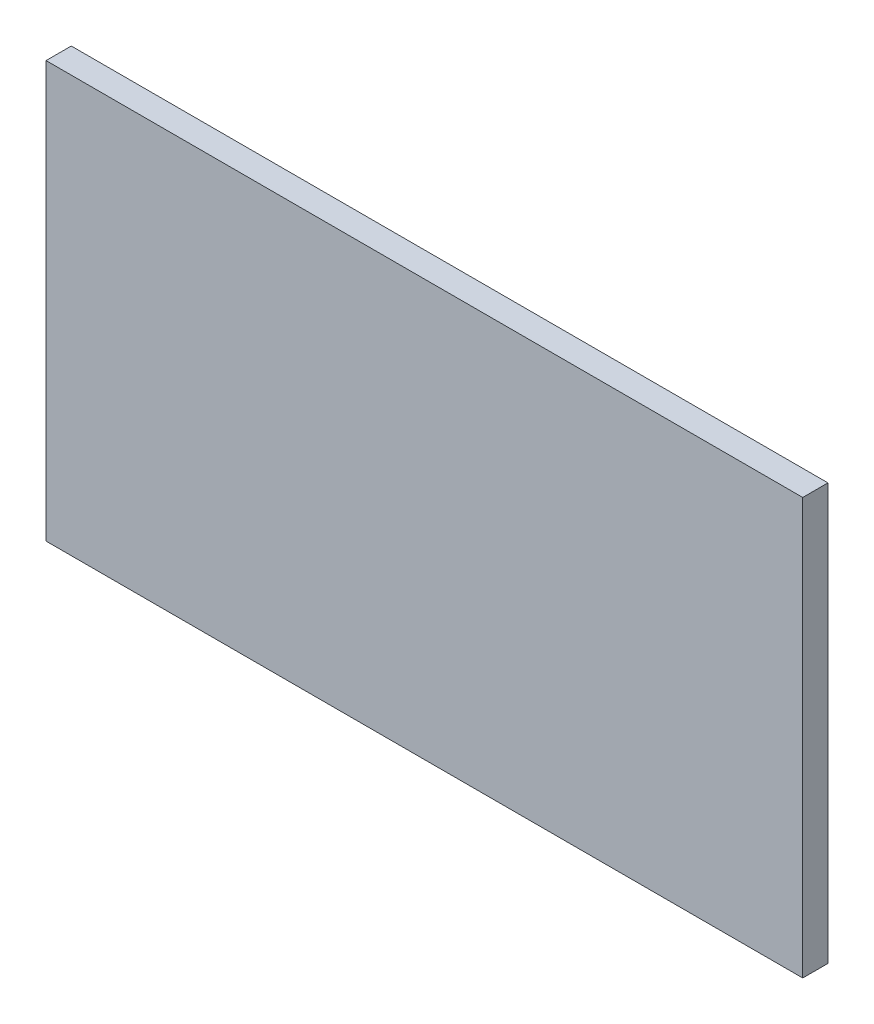
ISO-10303-21;
HEADER;
FILE_DESCRIPTION(('STEP AP214'),'2;1');
FILE_NAME('part.step','',(''),(''),'','','');
FILE_SCHEMA(('AUTOMOTIVE_DESIGN { 1 0 10303 214 1 1 1 1 }'));
ENDSEC;
DATA;
#1=APPLICATION_CONTEXT('core data for automotive mechanical design processes');
#2=APPLICATION_PROTOCOL_DEFINITION('international standard','automotive_design',2000,#1);
#3=PRODUCT_CONTEXT('',#1,'mechanical');
#4=PRODUCT('Part','Part','',(#3));
#5=PRODUCT_RELATED_PRODUCT_CATEGORY('part','',(#4));
#6=PRODUCT_DEFINITION_FORMATION('','',#4);
#7=PRODUCT_DEFINITION_CONTEXT('part definition',#1,'design');
#8=PRODUCT_DEFINITION('design','',#6,#7);
#9=PRODUCT_DEFINITION_SHAPE('','',#8);
#10=(LENGTH_UNIT() NAMED_UNIT(*) SI_UNIT(.MILLI.,.METRE.));
#11=(NAMED_UNIT(*) PLANE_ANGLE_UNIT() SI_UNIT($,.RADIAN.));
#12=(NAMED_UNIT(*) SI_UNIT($,.STERADIAN.) SOLID_ANGLE_UNIT());
#13=UNCERTAINTY_MEASURE_WITH_UNIT(LENGTH_MEASURE(1.E-05),#10,'distance_accuracy_value','');
#14=(GEOMETRIC_REPRESENTATION_CONTEXT(3) GLOBAL_UNCERTAINTY_ASSIGNED_CONTEXT((#13)) GLOBAL_UNIT_ASSIGNED_CONTEXT((#10,
#11,#12)) REPRESENTATION_CONTEXT('',''));
#15=CARTESIAN_POINT('',(0.,0.,0.));
#16=DIRECTION('',(0.,0.,1.));
#17=DIRECTION('',(1.,0.,0.));
#18=AXIS2_PLACEMENT_3D('',#15,#16,#17);
#19=CARTESIAN_POINT('',(0.,0.,10.));
#20=DIRECTION('',(1.,0.,0.));
#21=DIRECTION('',(0.,0.,-1.));
#22=AXIS2_PLACEMENT_3D('',#19,#20,#21);
#23=PLANE('',#22);
#24=DIRECTION('',(0.,-1.,0.));
#25=VECTOR('',#24,1.);
#26=CARTESIAN_POINT('',(0.,0.,0.));
#27=LINE('',#26,#25);
#28=CARTESIAN_POINT('',(0.,165.,0.));
#29=VERTEX_POINT('',#28);
#30=CARTESIAN_POINT('',(0.,0.,0.));
#31=VERTEX_POINT('',#30);
#32=EDGE_CURVE('E100',#29,#31,#27,.T.);
#33=ORIENTED_EDGE('',*,*,#32,.T.);
#34=DIRECTION('',(0.,0.,-1.));
#35=VECTOR('',#34,1.);
#36=CARTESIAN_POINT('',(0.,0.,10.));
#37=LINE('',#36,#35);
#38=CARTESIAN_POINT('',(0.,0.,10.));
#39=VERTEX_POINT('',#38);
#40=EDGE_CURVE('E11',#39,#31,#37,.T.);
#41=ORIENTED_EDGE('',*,*,#40,.F.);
#42=DIRECTION('',(0.,-1.,0.));
#43=VECTOR('',#42,1.);
#44=CARTESIAN_POINT('',(0.,0.,10.));
#45=LINE('',#44,#43);
#46=CARTESIAN_POINT('',(0.,165.,10.));
#47=VERTEX_POINT('',#46);
#48=EDGE_CURVE('E88',#47,#39,#45,.T.);
#49=ORIENTED_EDGE('',*,*,#48,.F.);
#50=DIRECTION('',(0.,0.,-1.));
#51=VECTOR('',#50,1.);
#52=CARTESIAN_POINT('',(0.,165.,10.));
#53=LINE('',#52,#51);
#54=EDGE_CURVE('E96',#47,#29,#53,.T.);
#55=ORIENTED_EDGE('',*,*,#54,.T.);
#56=EDGE_LOOP('',(#33,#41,#49,#55));
#57=FACE_BOUND('',#56,.T.);
#58=ADVANCED_FACE('F37',(#57),#23,.F.);
#59=CARTESIAN_POINT('',(0.,0.,10.));
#60=DIRECTION('',(0.,1.,0.));
#61=DIRECTION('',(0.,0.,1.));
#62=AXIS2_PLACEMENT_3D('',#59,#60,#61);
#63=PLANE('',#62);
#64=DIRECTION('',(1.,0.,0.));
#65=VECTOR('',#64,1.);
#66=CARTESIAN_POINT('',(0.,0.,0.));
#67=LINE('',#66,#65);
#68=CARTESIAN_POINT('',(300.,0.,0.));
#69=VERTEX_POINT('',#68);
#70=EDGE_CURVE('E92',#31,#69,#67,.T.);
#71=ORIENTED_EDGE('',*,*,#70,.T.);
#72=DIRECTION('',(0.,0.,-1.));
#73=VECTOR('',#72,1.);
#74=CARTESIAN_POINT('',(300.,0.,10.));
#75=LINE('',#74,#73);
#76=CARTESIAN_POINT('',(300.,0.,10.));
#77=VERTEX_POINT('',#76);
#78=EDGE_CURVE('E45',#77,#69,#75,.T.);
#79=ORIENTED_EDGE('',*,*,#78,.F.);
#80=DIRECTION('',(1.,0.,0.));
#81=VECTOR('',#80,1.);
#82=CARTESIAN_POINT('',(0.,0.,10.));
#83=LINE('',#82,#81);
#84=EDGE_CURVE('E83',#39,#77,#83,.T.);
#85=ORIENTED_EDGE('',*,*,#84,.F.);
#86=ORIENTED_EDGE('',*,*,#40,.T.);
#87=EDGE_LOOP('',(#71,#79,#85,#86));
#88=FACE_BOUND('',#87,.T.);
#89=ADVANCED_FACE('F91',(#88),#63,.F.);
#90=CARTESIAN_POINT('',(300.,0.,10.));
#91=DIRECTION('',(-1.,0.,0.));
#92=DIRECTION('',(0.,-1.,0.));
#93=AXIS2_PLACEMENT_3D('',#90,#91,#92);
#94=PLANE('',#93);
#95=DIRECTION('',(0.,1.,0.));
#96=VECTOR('',#95,1.);
#97=CARTESIAN_POINT('',(300.,0.,0.));
#98=LINE('',#97,#96);
#99=CARTESIAN_POINT('',(300.,165.,0.));
#100=VERTEX_POINT('',#99);
#101=EDGE_CURVE('E70',#69,#100,#98,.T.);
#102=ORIENTED_EDGE('',*,*,#101,.T.);
#103=DIRECTION('',(0.,0.,-1.));
#104=VECTOR('',#103,1.);
#105=CARTESIAN_POINT('',(300.,165.,10.));
#106=LINE('',#105,#104);
#107=CARTESIAN_POINT('',(300.,165.,10.));
#108=VERTEX_POINT('',#107);
#109=EDGE_CURVE('E93',#108,#100,#106,.T.);
#110=ORIENTED_EDGE('',*,*,#109,.F.);
#111=DIRECTION('',(0.,1.,0.));
#112=VECTOR('',#111,1.);
#113=CARTESIAN_POINT('',(300.,0.,10.));
#114=LINE('',#113,#112);
#115=EDGE_CURVE('E86',#77,#108,#114,.T.);
#116=ORIENTED_EDGE('',*,*,#115,.F.);
#117=ORIENTED_EDGE('',*,*,#78,.T.);
#118=EDGE_LOOP('',(#102,#110,#116,#117));
#119=FACE_BOUND('',#118,.T.);
#120=ADVANCED_FACE('F94',(#119),#94,.F.);
#121=CARTESIAN_POINT('',(0.,165.,10.));
#122=DIRECTION('',(0.,-1.,0.));
#123=DIRECTION('',(0.,0.,-1.));
#124=AXIS2_PLACEMENT_3D('',#121,#122,#123);
#125=PLANE('',#124);
#126=DIRECTION('',(-1.,0.,0.));
#127=VECTOR('',#126,1.);
#128=CARTESIAN_POINT('',(0.,165.,0.));
#129=LINE('',#128,#127);
#130=EDGE_CURVE('E76',#100,#29,#129,.T.);
#131=ORIENTED_EDGE('',*,*,#130,.T.);
#132=ORIENTED_EDGE('',*,*,#54,.F.);
#133=DIRECTION('',(-1.,0.,0.));
#134=VECTOR('',#133,1.);
#135=CARTESIAN_POINT('',(0.,165.,10.));
#136=LINE('',#135,#134);
#137=EDGE_CURVE('E53',#108,#47,#136,.T.);
#138=ORIENTED_EDGE('',*,*,#137,.F.);
#139=ORIENTED_EDGE('',*,*,#109,.T.);
#140=EDGE_LOOP('',(#131,#132,#138,#139));
#141=FACE_BOUND('',#140,.T.);
#142=ADVANCED_FACE('F107',(#141),#125,.F.);
#143=CARTESIAN_POINT('',(0.,0.,10.));
#144=DIRECTION('',(0.,0.,-1.));
#145=DIRECTION('',(-1.,0.,0.));
#146=AXIS2_PLACEMENT_3D('',#143,#144,#145);
#147=PLANE('',#146);
#148=ORIENTED_EDGE('',*,*,#48,.T.);
#149=ORIENTED_EDGE('',*,*,#84,.T.);
#150=ORIENTED_EDGE('',*,*,#115,.T.);
#151=ORIENTED_EDGE('',*,*,#137,.T.);
#152=EDGE_LOOP('',(#148,#149,#150,#151));
#153=FACE_BOUND('',#152,.T.);
#154=ADVANCED_FACE('F84',(#153),#147,.F.);
#155=CARTESIAN_POINT('',(0.,0.,0.));
#156=DIRECTION('',(0.,0.,-1.));
#157=DIRECTION('',(-1.,0.,0.));
#158=AXIS2_PLACEMENT_3D('',#155,#156,#157);
#159=PLANE('',#158);
#160=ORIENTED_EDGE('',*,*,#32,.F.);
#161=ORIENTED_EDGE('',*,*,#130,.F.);
#162=ORIENTED_EDGE('',*,*,#101,.F.);
#163=ORIENTED_EDGE('',*,*,#70,.F.);
#164=EDGE_LOOP('',(#160,#161,#162,#163));
#165=FACE_BOUND('',#164,.T.);
#166=ADVANCED_FACE('F110',(#165),#159,.T.);
#167=CLOSED_SHELL('',(#58,#89,#120,#142,#154,#166));
#168=MANIFOLD_SOLID_BREP('B2',#167);
#169=ADVANCED_BREP_SHAPE_REPRESENTATION('',(#18,#168),#14);
#170=SHAPE_DEFINITION_REPRESENTATION(#9,#169);
ENDSEC;
END-ISO-10303-21;
